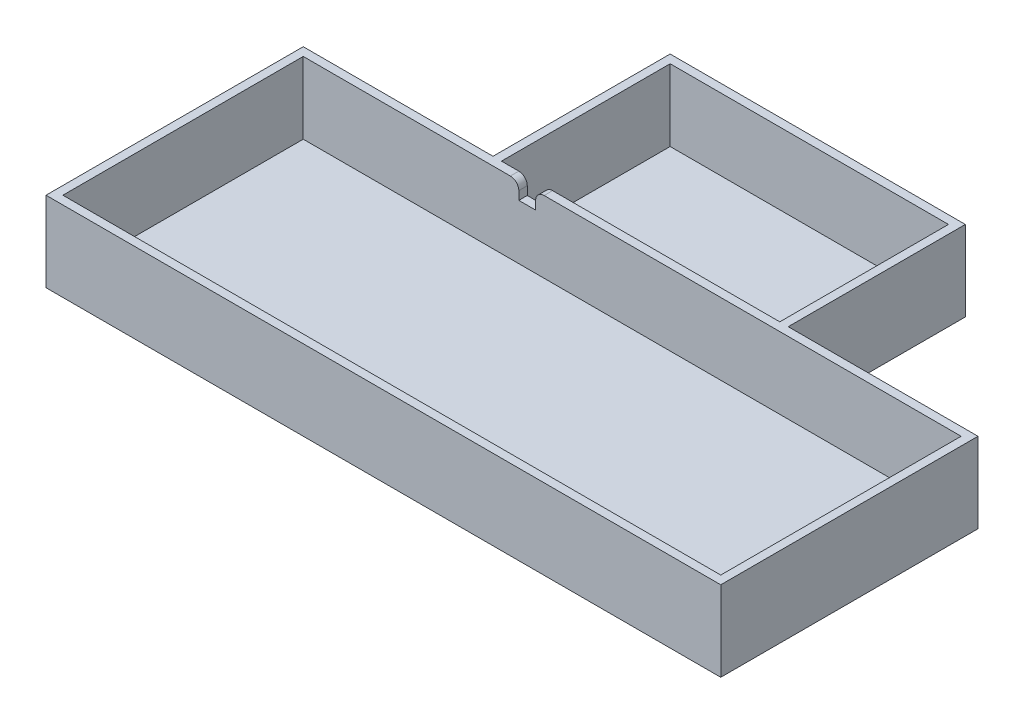
ISO-10303-21;
HEADER;
FILE_DESCRIPTION(('STEP AP214'),'2;1');
FILE_NAME('part.step','',(''),(''),'','','');
FILE_SCHEMA(('AUTOMOTIVE_DESIGN { 1 0 10303 214 1 1 1 1 }'));
ENDSEC;
DATA;
#1=APPLICATION_CONTEXT('core data for automotive mechanical design processes');
#2=APPLICATION_PROTOCOL_DEFINITION('international standard','automotive_design',2000,#1);
#3=PRODUCT_CONTEXT('',#1,'mechanical');
#4=PRODUCT('Part','Part','',(#3));
#5=PRODUCT_RELATED_PRODUCT_CATEGORY('part','',(#4));
#6=PRODUCT_DEFINITION_FORMATION('','',#4);
#7=PRODUCT_DEFINITION_CONTEXT('part definition',#1,'design');
#8=PRODUCT_DEFINITION('design','',#6,#7);
#9=PRODUCT_DEFINITION_SHAPE('','',#8);
#10=(LENGTH_UNIT() NAMED_UNIT(*) SI_UNIT(.MILLI.,.METRE.));
#11=(NAMED_UNIT(*) PLANE_ANGLE_UNIT() SI_UNIT($,.RADIAN.));
#12=(NAMED_UNIT(*) SI_UNIT($,.STERADIAN.) SOLID_ANGLE_UNIT());
#13=UNCERTAINTY_MEASURE_WITH_UNIT(LENGTH_MEASURE(1.E-05),#10,'distance_accuracy_value','');
#14=(GEOMETRIC_REPRESENTATION_CONTEXT(3) GLOBAL_UNCERTAINTY_ASSIGNED_CONTEXT((#13)) GLOBAL_UNIT_ASSIGNED_CONTEXT((#10,
#11,#12)) REPRESENTATION_CONTEXT('',''));
#15=CARTESIAN_POINT('',(0.,0.,0.));
#16=DIRECTION('',(0.,0.,1.));
#17=DIRECTION('',(1.,0.,0.));
#18=AXIS2_PLACEMENT_3D('',#15,#16,#17);
#19=CARTESIAN_POINT('',(0.,2.,0.));
#20=DIRECTION('',(0.,0.,1.));
#21=DIRECTION('',(1.,0.,0.));
#22=AXIS2_PLACEMENT_3D('',#19,#20,#21);
#23=PLANE('',#22);
#24=DIRECTION('',(1.,0.,0.));
#25=VECTOR('',#24,1.);
#26=CARTESIAN_POINT('',(0.,19.,0.));
#27=LINE('',#26,#25);
#28=CARTESIAN_POINT('',(0.,19.,0.));
#29=VERTEX_POINT('',#28);
#30=CARTESIAN_POINT('',(45.0000000000007,19.,0.));
#31=VERTEX_POINT('',#30);
#32=EDGE_CURVE('E357',#29,#31,#27,.T.);
#33=ORIENTED_EDGE('',*,*,#32,.T.);
#34=DIRECTION('',(0.,1.,0.));
#35=VECTOR('',#34,1.);
#36=CARTESIAN_POINT('',(45.0000000000007,0.,0.));
#37=LINE('',#36,#35);
#38=CARTESIAN_POINT('',(45.0000000000007,0.,0.));
#39=VERTEX_POINT('',#38);
#40=EDGE_CURVE('E275',#39,#31,#37,.T.);
#41=ORIENTED_EDGE('',*,*,#40,.F.);
#42=DIRECTION('',(-1.,0.,0.));
#43=VECTOR('',#42,1.);
#44=CARTESIAN_POINT('',(0.,0.,0.));
#45=LINE('',#44,#43);
#46=CARTESIAN_POINT('',(0.,0.,0.));
#47=VERTEX_POINT('',#46);
#48=EDGE_CURVE('E375',#39,#47,#45,.T.);
#49=ORIENTED_EDGE('',*,*,#48,.T.);
#50=DIRECTION('',(0.,-1.,0.));
#51=VECTOR('',#50,1.);
#52=CARTESIAN_POINT('',(0.,2.,0.));
#53=LINE('',#52,#51);
#54=EDGE_CURVE('E379',#29,#47,#53,.T.);
#55=ORIENTED_EDGE('',*,*,#54,.F.);
#56=EDGE_LOOP('',(#33,#41,#49,#55));
#57=FACE_BOUND('',#56,.T.);
#58=ADVANCED_FACE('F41',(#57),#23,.F.);
#59=DIRECTION('',(-1.,0.,0.));
#60=VECTOR('',#59,1.);
#61=CARTESIAN_POINT('',(0.,1.99999999999997,0.));
#62=LINE('',#61,#60);
#63=CARTESIAN_POINT('',(113.000000000001,1.99999999999997,0.));
#64=VERTEX_POINT('',#63);
#65=CARTESIAN_POINT('',(47.0000000000007,1.99999999999997,0.));
#66=VERTEX_POINT('',#65);
#67=EDGE_CURVE('E289',#64,#66,#62,.T.);
#68=ORIENTED_EDGE('',*,*,#67,.T.);
#69=DIRECTION('',(0.,-1.,0.));
#70=VECTOR('',#69,1.);
#71=CARTESIAN_POINT('',(47.0000000000007,19.,0.));
#72=LINE('',#71,#70);
#73=CARTESIAN_POINT('',(47.0000000000007,19.,0.));
#74=VERTEX_POINT('',#73);
#75=EDGE_CURVE('E219',#74,#66,#72,.T.);
#76=ORIENTED_EDGE('',*,*,#75,.F.);
#77=CARTESIAN_POINT('',(51.1169372831861,19.,0.));
#78=VERTEX_POINT('',#77);
#79=EDGE_CURVE('E207',#74,#78,#27,.T.);
#80=ORIENTED_EDGE('',*,*,#79,.T.);
#81=CARTESIAN_POINT('',(51.1169372831861,17.,0.));
#82=DIRECTION('',(0.,0.,1.));
#83=DIRECTION('',(1.,0.,0.));
#84=AXIS2_PLACEMENT_3D('',#81,#82,#83);
#85=CIRCLE('',#84,2.);
#86=CARTESIAN_POINT('',(53.1169372831861,17.,0.));
#87=VERTEX_POINT('',#86);
#88=EDGE_CURVE('E404',#78,#87,#85,.F.);
#89=ORIENTED_EDGE('',*,*,#88,.T.);
#90=DIRECTION('',(0.,-1.,0.));
#91=VECTOR('',#90,1.);
#92=CARTESIAN_POINT('',(53.1169372831861,23.,0.));
#93=LINE('',#92,#91);
#94=CARTESIAN_POINT('',(53.1169372831861,15.,0.));
#95=VERTEX_POINT('',#94);
#96=EDGE_CURVE('E254',#87,#95,#93,.T.);
#97=ORIENTED_EDGE('',*,*,#96,.T.);
#98=DIRECTION('',(-1.,0.,0.));
#99=VECTOR('',#98,1.);
#100=CARTESIAN_POINT('',(57.1169372831861,15.,0.));
#101=LINE('',#100,#99);
#102=CARTESIAN_POINT('',(57.1169372831861,15.,0.));
#103=VERTEX_POINT('',#102);
#104=EDGE_CURVE('E250',#103,#95,#101,.T.);
#105=ORIENTED_EDGE('',*,*,#104,.F.);
#106=DIRECTION('',(0.,-1.,0.));
#107=VECTOR('',#106,1.);
#108=CARTESIAN_POINT('',(57.1169372831861,23.,0.));
#109=LINE('',#108,#107);
#110=CARTESIAN_POINT('',(57.1169372831861,17.,0.));
#111=VERTEX_POINT('',#110);
#112=EDGE_CURVE('E247',#111,#103,#109,.T.);
#113=ORIENTED_EDGE('',*,*,#112,.F.);
#114=CARTESIAN_POINT('',(59.1169372831861,17.,0.));
#115=DIRECTION('',(0.,0.,1.));
#116=DIRECTION('',(1.,0.,0.));
#117=AXIS2_PLACEMENT_3D('',#114,#115,#116);
#118=CIRCLE('',#117,2.);
#119=CARTESIAN_POINT('',(59.1169372831861,19.,0.));
#120=VERTEX_POINT('',#119);
#121=EDGE_CURVE('E401',#111,#120,#118,.F.);
#122=ORIENTED_EDGE('',*,*,#121,.T.);
#123=CARTESIAN_POINT('',(113.000000000001,19.,0.));
#124=VERTEX_POINT('',#123);
#125=EDGE_CURVE('E362',#120,#124,#27,.T.);
#126=ORIENTED_EDGE('',*,*,#125,.T.);
#127=DIRECTION('',(0.,-1.,0.));
#128=VECTOR('',#127,1.);
#129=CARTESIAN_POINT('',(113.000000000001,19.,0.));
#130=LINE('',#129,#128);
#131=EDGE_CURVE('E241',#124,#64,#130,.T.);
#132=ORIENTED_EDGE('',*,*,#131,.T.);
#133=EDGE_LOOP('',(#68,#76,#80,#89,#97,#105,#113,#122,#126,#132));
#134=FACE_BOUND('',#133,.T.);
#135=ADVANCED_FACE('F427',(#134),#23,.F.);
#136=CARTESIAN_POINT('',(0.,1.99999999999997,-42.));
#137=DIRECTION('',(0.,1.,0.));
#138=DIRECTION('',(0.,0.,1.));
#139=AXIS2_PLACEMENT_3D('',#136,#137,#138);
#140=PLANE('',#139);
#141=DIRECTION('',(0.,0.,1.));
#142=VECTOR('',#141,1.);
#143=CARTESIAN_POINT('',(47.0000000000007,1.99999999999997,0.));
#144=LINE('',#143,#142);
#145=CARTESIAN_POINT('',(47.0000000000007,1.99999999999997,-40.));
#146=VERTEX_POINT('',#145);
#147=EDGE_CURVE('E196',#146,#66,#144,.T.);
#148=ORIENTED_EDGE('',*,*,#147,.T.);
#149=ORIENTED_EDGE('',*,*,#67,.F.);
#150=DIRECTION('',(0.,0.,1.));
#151=VECTOR('',#150,1.);
#152=CARTESIAN_POINT('',(113.000000000001,1.99999999999997,-42.));
#153=LINE('',#152,#151);
#154=CARTESIAN_POINT('',(113.000000000001,1.99999999999997,-40.));
#155=VERTEX_POINT('',#154);
#156=EDGE_CURVE('E200',#155,#64,#153,.T.);
#157=ORIENTED_EDGE('',*,*,#156,.F.);
#158=DIRECTION('',(-1.,0.,0.));
#159=VECTOR('',#158,1.);
#160=CARTESIAN_POINT('',(0.,1.99999999999997,-40.));
#161=LINE('',#160,#159);
#162=EDGE_CURVE('E209',#155,#146,#161,.T.);
#163=ORIENTED_EDGE('',*,*,#162,.T.);
#164=EDGE_LOOP('',(#148,#149,#157,#163));
#165=FACE_BOUND('',#164,.T.);
#166=ADVANCED_FACE('F498',(#165),#140,.T.);
#167=CARTESIAN_POINT('',(0.,19.,2.));
#168=DIRECTION('',(0.,0.,-1.));
#169=DIRECTION('',(-1.,0.,0.));
#170=AXIS2_PLACEMENT_3D('',#167,#168,#169);
#171=PLANE('',#170);
#172=DIRECTION('',(0.,-1.,0.));
#173=VECTOR('',#172,1.);
#174=CARTESIAN_POINT('',(53.1169372831861,19.,2.));
#175=LINE('',#174,#173);
#176=CARTESIAN_POINT('',(53.1169372831861,17.,2.));
#177=VERTEX_POINT('',#176);
#178=CARTESIAN_POINT('',(53.1169372831861,15.,2.));
#179=VERTEX_POINT('',#178);
#180=EDGE_CURVE('E262',#177,#179,#175,.T.);
#181=ORIENTED_EDGE('',*,*,#180,.F.);
#182=CARTESIAN_POINT('',(51.1169372831861,17.,2.));
#183=DIRECTION('',(0.,0.,-1.));
#184=DIRECTION('',(-1.,0.,0.));
#185=AXIS2_PLACEMENT_3D('',#182,#183,#184);
#186=CIRCLE('',#185,2.);
#187=CARTESIAN_POINT('',(51.1169372831861,19.,2.));
#188=VERTEX_POINT('',#187);
#189=EDGE_CURVE('E50',#177,#188,#186,.F.);
#190=ORIENTED_EDGE('',*,*,#189,.T.);
#191=DIRECTION('',(1.,0.,0.));
#192=VECTOR('',#191,1.);
#193=CARTESIAN_POINT('',(0.,19.,2.));
#194=LINE('',#193,#192);
#195=CARTESIAN_POINT('',(2.00000000000001,19.,2.));
#196=VERTEX_POINT('',#195);
#197=EDGE_CURVE('E348',#196,#188,#194,.T.);
#198=ORIENTED_EDGE('',*,*,#197,.F.);
#199=DIRECTION('',(0.,-1.,0.));
#200=VECTOR('',#199,1.);
#201=CARTESIAN_POINT('',(2.00000000000001,19.,2.));
#202=LINE('',#201,#200);
#203=CARTESIAN_POINT('',(2.00000000000001,2.,2.));
#204=VERTEX_POINT('',#203);
#205=EDGE_CURVE('E320',#196,#204,#202,.T.);
#206=ORIENTED_EDGE('',*,*,#205,.T.);
#207=DIRECTION('',(1.,0.,0.));
#208=VECTOR('',#207,1.);
#209=CARTESIAN_POINT('',(0.,2.,2.));
#210=LINE('',#209,#208);
#211=CARTESIAN_POINT('',(158.,2.,2.));
#212=VERTEX_POINT('',#211);
#213=EDGE_CURVE('E342',#204,#212,#210,.T.);
#214=ORIENTED_EDGE('',*,*,#213,.T.);
#215=DIRECTION('',(0.,-1.,0.));
#216=VECTOR('',#215,1.);
#217=CARTESIAN_POINT('',(158.,19.,2.));
#218=LINE('',#217,#216);
#219=CARTESIAN_POINT('',(158.,19.,2.));
#220=VERTEX_POINT('',#219);
#221=EDGE_CURVE('E339',#220,#212,#218,.T.);
#222=ORIENTED_EDGE('',*,*,#221,.F.);
#223=CARTESIAN_POINT('',(59.1169372831861,19.,2.));
#224=VERTEX_POINT('',#223);
#225=EDGE_CURVE('E347',#224,#220,#194,.T.);
#226=ORIENTED_EDGE('',*,*,#225,.F.);
#227=CARTESIAN_POINT('',(59.1169372831861,17.,2.));
#228=DIRECTION('',(0.,0.,-1.));
#229=DIRECTION('',(-1.,0.,0.));
#230=AXIS2_PLACEMENT_3D('',#227,#228,#229);
#231=CIRCLE('',#230,2.);
#232=CARTESIAN_POINT('',(57.1169372831861,17.,2.));
#233=VERTEX_POINT('',#232);
#234=EDGE_CURVE('E410',#224,#233,#231,.F.);
#235=ORIENTED_EDGE('',*,*,#234,.T.);
#236=DIRECTION('',(0.,-1.,0.));
#237=VECTOR('',#236,1.);
#238=CARTESIAN_POINT('',(57.1169372831861,19.,2.));
#239=LINE('',#238,#237);
#240=CARTESIAN_POINT('',(57.1169372831861,15.,2.));
#241=VERTEX_POINT('',#240);
#242=EDGE_CURVE('E268',#233,#241,#239,.T.);
#243=ORIENTED_EDGE('',*,*,#242,.T.);
#244=DIRECTION('',(-1.,0.,0.));
#245=VECTOR('',#244,1.);
#246=CARTESIAN_POINT('',(0.,15.,2.));
#247=LINE('',#246,#245);
#248=EDGE_CURVE('E271',#241,#179,#247,.T.);
#249=ORIENTED_EDGE('',*,*,#248,.T.);
#250=EDGE_LOOP('',(#181,#190,#198,#206,#214,#222,#226,#235,#243,#249));
#251=FACE_BOUND('',#250,.T.);
#252=ADVANCED_FACE('F417',(#251),#171,.F.);
#253=CARTESIAN_POINT('',(0.,2.,0.));
#254=DIRECTION('',(1.,0.,0.));
#255=DIRECTION('',(0.,0.,-1.));
#256=AXIS2_PLACEMENT_3D('',#253,#254,#255);
#257=PLANE('',#256);
#258=DIRECTION('',(0.,-1.,0.));
#259=VECTOR('',#258,1.);
#260=CARTESIAN_POINT('',(0.,2.,61.));
#261=LINE('',#260,#259);
#262=CARTESIAN_POINT('',(0.,19.,61.));
#263=VERTEX_POINT('',#262);
#264=CARTESIAN_POINT('',(0.,0.,61.));
#265=VERTEX_POINT('',#264);
#266=EDGE_CURVE('E391',#263,#265,#261,.T.);
#267=ORIENTED_EDGE('',*,*,#266,.F.);
#268=DIRECTION('',(0.,0.,1.));
#269=VECTOR('',#268,1.);
#270=CARTESIAN_POINT('',(0.,19.,0.));
#271=LINE('',#270,#269);
#272=EDGE_CURVE('E343',#29,#263,#271,.T.);
#273=ORIENTED_EDGE('',*,*,#272,.F.);
#274=ORIENTED_EDGE('',*,*,#54,.T.);
#275=DIRECTION('',(0.,0.,1.));
#276=VECTOR('',#275,1.);
#277=CARTESIAN_POINT('',(0.,0.,0.));
#278=LINE('',#277,#276);
#279=EDGE_CURVE('E361',#47,#265,#278,.T.);
#280=ORIENTED_EDGE('',*,*,#279,.T.);
#281=EDGE_LOOP('',(#267,#273,#274,#280));
#282=FACE_BOUND('',#281,.T.);
#283=ADVANCED_FACE('F461',(#282),#257,.F.);
#284=CARTESIAN_POINT('',(0.,2.,61.));
#285=DIRECTION('',(0.,0.,-1.));
#286=DIRECTION('',(-1.,0.,0.));
#287=AXIS2_PLACEMENT_3D('',#284,#285,#286);
#288=PLANE('',#287);
#289=DIRECTION('',(1.,0.,0.));
#290=VECTOR('',#289,1.);
#291=CARTESIAN_POINT('',(0.,0.,61.));
#292=LINE('',#291,#290);
#293=CARTESIAN_POINT('',(160.,0.,61.));
#294=VERTEX_POINT('',#293);
#295=EDGE_CURVE('E369',#265,#294,#292,.T.);
#296=ORIENTED_EDGE('',*,*,#295,.T.);
#297=DIRECTION('',(0.,-1.,0.));
#298=VECTOR('',#297,1.);
#299=CARTESIAN_POINT('',(160.,2.,61.));
#300=LINE('',#299,#298);
#301=CARTESIAN_POINT('',(160.,19.,61.));
#302=VERTEX_POINT('',#301);
#303=EDGE_CURVE('E387',#302,#294,#300,.T.);
#304=ORIENTED_EDGE('',*,*,#303,.F.);
#305=DIRECTION('',(1.,0.,0.));
#306=VECTOR('',#305,1.);
#307=CARTESIAN_POINT('',(0.,19.,61.));
#308=LINE('',#307,#306);
#309=EDGE_CURVE('E303',#263,#302,#308,.T.);
#310=ORIENTED_EDGE('',*,*,#309,.F.);
#311=ORIENTED_EDGE('',*,*,#266,.T.);
#312=EDGE_LOOP('',(#296,#304,#310,#311));
#313=FACE_BOUND('',#312,.T.);
#314=ADVANCED_FACE('F468',(#313),#288,.F.);
#315=CARTESIAN_POINT('',(160.,2.,0.));
#316=DIRECTION('',(-1.,0.,0.));
#317=DIRECTION('',(0.,0.,1.));
#318=AXIS2_PLACEMENT_3D('',#315,#316,#317);
#319=PLANE('',#318);
#320=DIRECTION('',(0.,0.,-1.));
#321=VECTOR('',#320,1.);
#322=CARTESIAN_POINT('',(160.,0.,0.));
#323=LINE('',#322,#321);
#324=CARTESIAN_POINT('',(160.,0.,0.));
#325=VERTEX_POINT('',#324);
#326=EDGE_CURVE('E372',#294,#325,#323,.T.);
#327=ORIENTED_EDGE('',*,*,#326,.T.);
#328=DIRECTION('',(0.,-1.,0.));
#329=VECTOR('',#328,1.);
#330=CARTESIAN_POINT('',(160.,2.,0.));
#331=LINE('',#330,#329);
#332=CARTESIAN_POINT('',(160.,19.,0.));
#333=VERTEX_POINT('',#332);
#334=EDGE_CURVE('E383',#333,#325,#331,.T.);
#335=ORIENTED_EDGE('',*,*,#334,.F.);
#336=DIRECTION('',(0.,0.,1.));
#337=VECTOR('',#336,1.);
#338=CARTESIAN_POINT('',(160.,19.,0.));
#339=LINE('',#338,#337);
#340=EDGE_CURVE('E352',#333,#302,#339,.T.);
#341=ORIENTED_EDGE('',*,*,#340,.T.);
#342=ORIENTED_EDGE('',*,*,#303,.T.);
#343=EDGE_LOOP('',(#327,#335,#341,#342));
#344=FACE_BOUND('',#343,.T.);
#345=ADVANCED_FACE('F484',(#344),#319,.F.);
#346=DIRECTION('',(0.,1.,0.));
#347=VECTOR('',#346,1.);
#348=CARTESIAN_POINT('',(115.000000000001,0.,0.));
#349=LINE('',#348,#347);
#350=CARTESIAN_POINT('',(115.000000000001,0.,0.));
#351=VERTEX_POINT('',#350);
#352=CARTESIAN_POINT('',(115.000000000001,19.,0.));
#353=VERTEX_POINT('',#352);
#354=EDGE_CURVE('E65',#351,#353,#349,.T.);
#355=ORIENTED_EDGE('',*,*,#354,.T.);
#356=EDGE_CURVE('E356',#353,#333,#27,.T.);
#357=ORIENTED_EDGE('',*,*,#356,.T.);
#358=ORIENTED_EDGE('',*,*,#334,.T.);
#359=EDGE_CURVE('E376',#325,#351,#45,.T.);
#360=ORIENTED_EDGE('',*,*,#359,.T.);
#361=EDGE_LOOP('',(#355,#357,#358,#360));
#362=FACE_BOUND('',#361,.T.);
#363=ADVANCED_FACE('F482',(#362),#23,.F.);
#364=CARTESIAN_POINT('',(0.,2.,0.));
#365=DIRECTION('',(0.,1.,0.));
#366=DIRECTION('',(0.,0.,1.));
#367=AXIS2_PLACEMENT_3D('',#364,#365,#366);
#368=PLANE('',#367);
#369=DIRECTION('',(0.,0.,-1.));
#370=VECTOR('',#369,1.);
#371=CARTESIAN_POINT('',(158.,2.,0.));
#372=LINE('',#371,#370);
#373=CARTESIAN_POINT('',(158.,2.,59.));
#374=VERTEX_POINT('',#373);
#375=EDGE_CURVE('E302',#374,#212,#372,.T.);
#376=ORIENTED_EDGE('',*,*,#375,.T.);
#377=ORIENTED_EDGE('',*,*,#213,.F.);
#378=DIRECTION('',(0.,0.,-1.));
#379=VECTOR('',#378,1.);
#380=CARTESIAN_POINT('',(2.00000000000001,2.,0.));
#381=LINE('',#380,#379);
#382=CARTESIAN_POINT('',(2.00000000000001,2.,59.));
#383=VERTEX_POINT('',#382);
#384=EDGE_CURVE('E308',#383,#204,#381,.T.);
#385=ORIENTED_EDGE('',*,*,#384,.F.);
#386=DIRECTION('',(1.,0.,0.));
#387=VECTOR('',#386,1.);
#388=CARTESIAN_POINT('',(0.,2.,59.));
#389=LINE('',#388,#387);
#390=EDGE_CURVE('E324',#383,#374,#389,.T.);
#391=ORIENTED_EDGE('',*,*,#390,.T.);
#392=EDGE_LOOP('',(#376,#377,#385,#391));
#393=FACE_BOUND('',#392,.T.);
#394=ADVANCED_FACE('F491',(#393),#368,.T.);
#395=CARTESIAN_POINT('',(0.,0.,0.));
#396=DIRECTION('',(0.,1.,0.));
#397=DIRECTION('',(0.,0.,1.));
#398=AXIS2_PLACEMENT_3D('',#395,#396,#397);
#399=PLANE('',#398);
#400=ORIENTED_EDGE('',*,*,#279,.F.);
#401=ORIENTED_EDGE('',*,*,#48,.F.);
#402=DIRECTION('',(0.,0.,1.));
#403=VECTOR('',#402,1.);
#404=CARTESIAN_POINT('',(45.0000000000007,0.,-42.));
#405=LINE('',#404,#403);
#406=CARTESIAN_POINT('',(45.0000000000007,0.,-42.));
#407=VERTEX_POINT('',#406);
#408=EDGE_CURVE('E298',#407,#39,#405,.T.);
#409=ORIENTED_EDGE('',*,*,#408,.F.);
#410=DIRECTION('',(-1.,0.,0.));
#411=VECTOR('',#410,1.);
#412=CARTESIAN_POINT('',(0.,0.,-42.));
#413=LINE('',#412,#411);
#414=CARTESIAN_POINT('',(115.000000000001,0.,-42.));
#415=VERTEX_POINT('',#414);
#416=EDGE_CURVE('E276',#415,#407,#413,.T.);
#417=ORIENTED_EDGE('',*,*,#416,.F.);
#418=DIRECTION('',(0.,0.,1.));
#419=VECTOR('',#418,1.);
#420=CARTESIAN_POINT('',(115.000000000001,0.,-42.));
#421=LINE('',#420,#419);
#422=EDGE_CURVE('E286',#415,#351,#421,.T.);
#423=ORIENTED_EDGE('',*,*,#422,.T.);
#424=ORIENTED_EDGE('',*,*,#359,.F.);
#425=ORIENTED_EDGE('',*,*,#326,.F.);
#426=ORIENTED_EDGE('',*,*,#295,.F.);
#427=EDGE_LOOP('',(#400,#401,#409,#417,#423,#424,#425,#426));
#428=FACE_BOUND('',#427,.T.);
#429=ADVANCED_FACE('F463',(#428),#399,.F.);
#430=CARTESIAN_POINT('',(0.,19.,0.));
#431=DIRECTION('',(0.,1.,0.));
#432=DIRECTION('',(0.,0.,1.));
#433=AXIS2_PLACEMENT_3D('',#430,#431,#432);
#434=PLANE('',#433);
#435=ORIENTED_EDGE('',*,*,#79,.F.);
#436=DIRECTION('',(0.,0.,1.));
#437=VECTOR('',#436,1.);
#438=CARTESIAN_POINT('',(47.0000000000007,19.,0.));
#439=LINE('',#438,#437);
#440=CARTESIAN_POINT('',(47.0000000000007,19.,-40.));
#441=VERTEX_POINT('',#440);
#442=EDGE_CURVE('E193',#441,#74,#439,.T.);
#443=ORIENTED_EDGE('',*,*,#442,.F.);
#444=DIRECTION('',(-1.,0.,0.));
#445=VECTOR('',#444,1.);
#446=CARTESIAN_POINT('',(0.,19.,-40.));
#447=LINE('',#446,#445);
#448=CARTESIAN_POINT('',(113.000000000001,19.,-40.));
#449=VERTEX_POINT('',#448);
#450=EDGE_CURVE('E57',#449,#441,#447,.T.);
#451=ORIENTED_EDGE('',*,*,#450,.F.);
#452=DIRECTION('',(0.,0.,1.));
#453=VECTOR('',#452,1.);
#454=CARTESIAN_POINT('',(113.000000000001,19.,-42.));
#455=LINE('',#454,#453);
#456=EDGE_CURVE('E234',#449,#124,#455,.T.);
#457=ORIENTED_EDGE('',*,*,#456,.T.);
#458=ORIENTED_EDGE('',*,*,#125,.F.);
#459=DIRECTION('',(0.,0.,-1.));
#460=VECTOR('',#459,1.);
#461=CARTESIAN_POINT('',(59.1169372831861,19.,2.));
#462=LINE('',#461,#460);
#463=EDGE_CURVE('E395',#120,#224,#462,.F.);
#464=ORIENTED_EDGE('',*,*,#463,.T.);
#465=ORIENTED_EDGE('',*,*,#225,.T.);
#466=DIRECTION('',(0.,0.,-1.));
#467=VECTOR('',#466,1.);
#468=CARTESIAN_POINT('',(158.,19.,0.));
#469=LINE('',#468,#467);
#470=CARTESIAN_POINT('',(158.,19.,59.));
#471=VERTEX_POINT('',#470);
#472=EDGE_CURVE('E307',#471,#220,#469,.T.);
#473=ORIENTED_EDGE('',*,*,#472,.F.);
#474=DIRECTION('',(1.,0.,0.));
#475=VECTOR('',#474,1.);
#476=CARTESIAN_POINT('',(0.,19.,59.));
#477=LINE('',#476,#475);
#478=CARTESIAN_POINT('',(2.00000000000001,19.,59.));
#479=VERTEX_POINT('',#478);
#480=EDGE_CURVE('E312',#479,#471,#477,.T.);
#481=ORIENTED_EDGE('',*,*,#480,.F.);
#482=DIRECTION('',(0.,0.,-1.));
#483=VECTOR('',#482,1.);
#484=CARTESIAN_POINT('',(2.00000000000001,19.,0.));
#485=LINE('',#484,#483);
#486=EDGE_CURVE('E316',#479,#196,#485,.T.);
#487=ORIENTED_EDGE('',*,*,#486,.T.);
#488=ORIENTED_EDGE('',*,*,#197,.T.);
#489=DIRECTION('',(0.,0.,-1.));
#490=VECTOR('',#489,1.);
#491=CARTESIAN_POINT('',(51.1169372831861,19.,0.));
#492=LINE('',#491,#490);
#493=EDGE_CURVE('E398',#188,#78,#492,.T.);
#494=ORIENTED_EDGE('',*,*,#493,.T.);
#495=EDGE_LOOP('',(#435,#443,#451,#457,#458,#464,#465,#473,#481,#487,#488,#494));
#496=FACE_BOUND('',#495,.T.);
#497=DIRECTION('',(0.,0.,1.));
#498=VECTOR('',#497,1.);
#499=CARTESIAN_POINT('',(45.0000000000007,19.,0.));
#500=LINE('',#499,#498);
#501=CARTESIAN_POINT('',(45.0000000000007,19.,-42.));
#502=VERTEX_POINT('',#501);
#503=EDGE_CURVE('E215',#502,#31,#500,.T.);
#504=ORIENTED_EDGE('',*,*,#503,.T.);
#505=ORIENTED_EDGE('',*,*,#32,.F.);
#506=ORIENTED_EDGE('',*,*,#272,.T.);
#507=ORIENTED_EDGE('',*,*,#309,.T.);
#508=ORIENTED_EDGE('',*,*,#340,.F.);
#509=ORIENTED_EDGE('',*,*,#356,.F.);
#510=DIRECTION('',(0.,0.,1.));
#511=VECTOR('',#510,1.);
#512=CARTESIAN_POINT('',(115.000000000001,19.,-42.));
#513=LINE('',#512,#511);
#514=CARTESIAN_POINT('',(115.000000000001,19.,-42.));
#515=VERTEX_POINT('',#514);
#516=EDGE_CURVE('E237',#515,#353,#513,.T.);
#517=ORIENTED_EDGE('',*,*,#516,.F.);
#518=DIRECTION('',(-1.,0.,0.));
#519=VECTOR('',#518,1.);
#520=CARTESIAN_POINT('',(115.000000000001,19.,-42.));
#521=LINE('',#520,#519);
#522=EDGE_CURVE('E230',#515,#502,#521,.T.);
#523=ORIENTED_EDGE('',*,*,#522,.T.);
#524=EDGE_LOOP('',(#504,#505,#506,#507,#508,#509,#517,#523));
#525=FACE_BOUND('',#524,.T.);
#526=ADVANCED_FACE('F204',(#496,#525),#434,.T.);
#527=CARTESIAN_POINT('',(158.,19.,0.));
#528=DIRECTION('',(-1.,0.,0.));
#529=DIRECTION('',(0.,0.,1.));
#530=AXIS2_PLACEMENT_3D('',#527,#528,#529);
#531=PLANE('',#530);
#532=ORIENTED_EDGE('',*,*,#375,.F.);
#533=DIRECTION('',(0.,-1.,0.));
#534=VECTOR('',#533,1.);
#535=CARTESIAN_POINT('',(158.,19.,59.));
#536=LINE('',#535,#534);
#537=EDGE_CURVE('E336',#471,#374,#536,.T.);
#538=ORIENTED_EDGE('',*,*,#537,.F.);
#539=ORIENTED_EDGE('',*,*,#472,.T.);
#540=ORIENTED_EDGE('',*,*,#221,.T.);
#541=EDGE_LOOP('',(#532,#538,#539,#540));
#542=FACE_BOUND('',#541,.T.);
#543=ADVANCED_FACE('F509',(#542),#531,.T.);
#544=CARTESIAN_POINT('',(0.,19.,59.));
#545=DIRECTION('',(0.,0.,-1.));
#546=DIRECTION('',(-1.,0.,0.));
#547=AXIS2_PLACEMENT_3D('',#544,#545,#546);
#548=PLANE('',#547);
#549=ORIENTED_EDGE('',*,*,#390,.F.);
#550=DIRECTION('',(0.,-1.,0.));
#551=VECTOR('',#550,1.);
#552=CARTESIAN_POINT('',(2.00000000000001,19.,59.));
#553=LINE('',#552,#551);
#554=EDGE_CURVE('E333',#479,#383,#553,.T.);
#555=ORIENTED_EDGE('',*,*,#554,.F.);
#556=ORIENTED_EDGE('',*,*,#480,.T.);
#557=ORIENTED_EDGE('',*,*,#537,.T.);
#558=EDGE_LOOP('',(#549,#555,#556,#557));
#559=FACE_BOUND('',#558,.T.);
#560=ADVANCED_FACE('F512',(#559),#548,.T.);
#561=CARTESIAN_POINT('',(2.00000000000001,19.,0.));
#562=DIRECTION('',(-1.,0.,0.));
#563=DIRECTION('',(0.,0.,1.));
#564=AXIS2_PLACEMENT_3D('',#561,#562,#563);
#565=PLANE('',#564);
#566=ORIENTED_EDGE('',*,*,#384,.T.);
#567=ORIENTED_EDGE('',*,*,#205,.F.);
#568=ORIENTED_EDGE('',*,*,#486,.F.);
#569=ORIENTED_EDGE('',*,*,#554,.T.);
#570=EDGE_LOOP('',(#566,#567,#568,#569));
#571=FACE_BOUND('',#570,.T.);
#572=ADVANCED_FACE('F516',(#571),#565,.F.);
#573=CARTESIAN_POINT('',(45.0000000000007,0.,-42.));
#574=DIRECTION('',(1.,0.,0.));
#575=DIRECTION('',(0.,0.,-1.));
#576=AXIS2_PLACEMENT_3D('',#573,#574,#575);
#577=PLANE('',#576);
#578=ORIENTED_EDGE('',*,*,#40,.T.);
#579=ORIENTED_EDGE('',*,*,#503,.F.);
#580=DIRECTION('',(0.,1.,0.));
#581=VECTOR('',#580,1.);
#582=CARTESIAN_POINT('',(45.0000000000007,0.,-42.));
#583=LINE('',#582,#581);
#584=EDGE_CURVE('E280',#407,#502,#583,.T.);
#585=ORIENTED_EDGE('',*,*,#584,.F.);
#586=ORIENTED_EDGE('',*,*,#408,.T.);
#587=EDGE_LOOP('',(#578,#579,#585,#586));
#588=FACE_BOUND('',#587,.T.);
#589=ADVANCED_FACE('F474',(#588),#577,.F.);
#590=CARTESIAN_POINT('',(115.000000000001,0.,-42.));
#591=DIRECTION('',(1.,0.,0.));
#592=DIRECTION('',(0.,0.,-1.));
#593=AXIS2_PLACEMENT_3D('',#590,#591,#592);
#594=PLANE('',#593);
#595=ORIENTED_EDGE('',*,*,#354,.F.);
#596=ORIENTED_EDGE('',*,*,#422,.F.);
#597=DIRECTION('',(0.,1.,0.));
#598=VECTOR('',#597,1.);
#599=CARTESIAN_POINT('',(115.000000000001,0.,-42.));
#600=LINE('',#599,#598);
#601=EDGE_CURVE('E283',#415,#515,#600,.T.);
#602=ORIENTED_EDGE('',*,*,#601,.T.);
#603=ORIENTED_EDGE('',*,*,#516,.T.);
#604=EDGE_LOOP('',(#595,#596,#602,#603));
#605=FACE_BOUND('',#604,.T.);
#606=ADVANCED_FACE('F480',(#605),#594,.T.);
#607=CARTESIAN_POINT('',(0.,0.,-42.));
#608=DIRECTION('',(0.,0.,-1.));
#609=DIRECTION('',(-1.,0.,0.));
#610=AXIS2_PLACEMENT_3D('',#607,#608,#609);
#611=PLANE('',#610);
#612=ORIENTED_EDGE('',*,*,#584,.T.);
#613=ORIENTED_EDGE('',*,*,#522,.F.);
#614=ORIENTED_EDGE('',*,*,#601,.F.);
#615=ORIENTED_EDGE('',*,*,#416,.T.);
#616=EDGE_LOOP('',(#612,#613,#614,#615));
#617=FACE_BOUND('',#616,.T.);
#618=ADVANCED_FACE('F478',(#617),#611,.T.);
#619=CARTESIAN_POINT('',(57.1169372831861,15.,39.));
#620=DIRECTION('',(0.,-1.,0.));
#621=DIRECTION('',(0.,0.,-1.));
#622=AXIS2_PLACEMENT_3D('',#619,#620,#621);
#623=PLANE('',#622);
#624=DIRECTION('',(0.,0.,-1.));
#625=VECTOR('',#624,1.);
#626=CARTESIAN_POINT('',(57.1169372831861,15.,39.));
#627=LINE('',#626,#625);
#628=EDGE_CURVE('E257',#241,#103,#627,.T.);
#629=ORIENTED_EDGE('',*,*,#628,.T.);
#630=ORIENTED_EDGE('',*,*,#104,.T.);
#631=DIRECTION('',(0.,0.,-1.));
#632=VECTOR('',#631,1.);
#633=CARTESIAN_POINT('',(53.1169372831861,15.,39.));
#634=LINE('',#633,#632);
#635=EDGE_CURVE('E258',#179,#95,#634,.T.);
#636=ORIENTED_EDGE('',*,*,#635,.F.);
#637=ORIENTED_EDGE('',*,*,#248,.F.);
#638=EDGE_LOOP('',(#629,#630,#636,#637));
#639=FACE_BOUND('',#638,.T.);
#640=ADVANCED_FACE('F434',(#639),#623,.F.);
#641=CARTESIAN_POINT('',(57.1169372831861,23.,39.));
#642=DIRECTION('',(1.,0.,0.));
#643=DIRECTION('',(0.,0.,-1.));
#644=AXIS2_PLACEMENT_3D('',#641,#642,#643);
#645=PLANE('',#644);
#646=ORIENTED_EDGE('',*,*,#242,.F.);
#647=DIRECTION('',(0.,0.,-1.));
#648=VECTOR('',#647,1.);
#649=CARTESIAN_POINT('',(57.1169372831861,17.,0.));
#650=LINE('',#649,#648);
#651=EDGE_CURVE('E11',#233,#111,#650,.T.);
#652=ORIENTED_EDGE('',*,*,#651,.T.);
#653=ORIENTED_EDGE('',*,*,#112,.T.);
#654=ORIENTED_EDGE('',*,*,#628,.F.);
#655=EDGE_LOOP('',(#646,#652,#653,#654));
#656=FACE_BOUND('',#655,.T.);
#657=ADVANCED_FACE('F441',(#656),#645,.F.);
#658=CARTESIAN_POINT('',(53.1169372831861,23.,39.));
#659=DIRECTION('',(1.,0.,0.));
#660=DIRECTION('',(0.,0.,-1.));
#661=AXIS2_PLACEMENT_3D('',#658,#659,#660);
#662=PLANE('',#661);
#663=ORIENTED_EDGE('',*,*,#96,.F.);
#664=DIRECTION('',(0.,0.,-1.));
#665=VECTOR('',#664,1.);
#666=CARTESIAN_POINT('',(53.1169372831861,17.,39.));
#667=LINE('',#666,#665);
#668=EDGE_CURVE('E407',#87,#177,#667,.F.);
#669=ORIENTED_EDGE('',*,*,#668,.T.);
#670=ORIENTED_EDGE('',*,*,#180,.T.);
#671=ORIENTED_EDGE('',*,*,#635,.T.);
#672=EDGE_LOOP('',(#663,#669,#670,#671));
#673=FACE_BOUND('',#672,.T.);
#674=ADVANCED_FACE('F430',(#673),#662,.T.);
#675=CARTESIAN_POINT('',(51.1169372831861,17.,0.));
#676=DIRECTION('',(0.,0.,-1.));
#677=DIRECTION('',(-1.,0.,0.));
#678=AXIS2_PLACEMENT_3D('',#675,#676,#677);
#679=CYLINDRICAL_SURFACE('',#678,2.);
#680=ORIENTED_EDGE('',*,*,#189,.F.);
#681=ORIENTED_EDGE('',*,*,#668,.F.);
#682=ORIENTED_EDGE('',*,*,#88,.F.);
#683=ORIENTED_EDGE('',*,*,#493,.F.);
#684=EDGE_LOOP('',(#680,#681,#682,#683));
#685=FACE_BOUND('',#684,.T.);
#686=ADVANCED_FACE('F424',(#685),#679,.T.);
#687=CARTESIAN_POINT('',(59.1169372831861,17.,39.));
#688=DIRECTION('',(0.,0.,1.));
#689=DIRECTION('',(1.,0.,0.));
#690=AXIS2_PLACEMENT_3D('',#687,#688,#689);
#691=CYLINDRICAL_SURFACE('',#690,2.);
#692=ORIENTED_EDGE('',*,*,#234,.F.);
#693=ORIENTED_EDGE('',*,*,#463,.F.);
#694=ORIENTED_EDGE('',*,*,#121,.F.);
#695=ORIENTED_EDGE('',*,*,#651,.F.);
#696=EDGE_LOOP('',(#692,#693,#694,#695));
#697=FACE_BOUND('',#696,.T.);
#698=ADVANCED_FACE('F43',(#697),#691,.T.);
#699=CARTESIAN_POINT('',(113.000000000001,19.,-42.));
#700=DIRECTION('',(1.,0.,0.));
#701=DIRECTION('',(0.,0.,-1.));
#702=AXIS2_PLACEMENT_3D('',#699,#700,#701);
#703=PLANE('',#702);
#704=ORIENTED_EDGE('',*,*,#456,.F.);
#705=DIRECTION('',(0.,-1.,0.));
#706=VECTOR('',#705,1.);
#707=CARTESIAN_POINT('',(113.000000000001,19.,-40.));
#708=LINE('',#707,#706);
#709=EDGE_CURVE('E201',#449,#155,#708,.T.);
#710=ORIENTED_EDGE('',*,*,#709,.T.);
#711=ORIENTED_EDGE('',*,*,#156,.T.);
#712=ORIENTED_EDGE('',*,*,#131,.F.);
#713=EDGE_LOOP('',(#704,#710,#711,#712));
#714=FACE_BOUND('',#713,.T.);
#715=ADVANCED_FACE('F536',(#714),#703,.F.);
#716=CARTESIAN_POINT('',(47.0000000000007,19.,0.));
#717=DIRECTION('',(1.,0.,0.));
#718=DIRECTION('',(0.,0.,-1.));
#719=AXIS2_PLACEMENT_3D('',#716,#717,#718);
#720=PLANE('',#719);
#721=ORIENTED_EDGE('',*,*,#147,.F.);
#722=DIRECTION('',(0.,-1.,0.));
#723=VECTOR('',#722,1.);
#724=CARTESIAN_POINT('',(47.0000000000007,19.,-40.));
#725=LINE('',#724,#723);
#726=EDGE_CURVE('E191',#441,#146,#725,.T.);
#727=ORIENTED_EDGE('',*,*,#726,.F.);
#728=ORIENTED_EDGE('',*,*,#442,.T.);
#729=ORIENTED_EDGE('',*,*,#75,.T.);
#730=EDGE_LOOP('',(#721,#727,#728,#729));
#731=FACE_BOUND('',#730,.T.);
#732=ADVANCED_FACE('F192',(#731),#720,.T.);
#733=CARTESIAN_POINT('',(0.,19.,-40.));
#734=DIRECTION('',(0.,0.,1.));
#735=DIRECTION('',(1.,0.,0.));
#736=AXIS2_PLACEMENT_3D('',#733,#734,#735);
#737=PLANE('',#736);
#738=ORIENTED_EDGE('',*,*,#162,.F.);
#739=ORIENTED_EDGE('',*,*,#709,.F.);
#740=ORIENTED_EDGE('',*,*,#450,.T.);
#741=ORIENTED_EDGE('',*,*,#726,.T.);
#742=EDGE_LOOP('',(#738,#739,#740,#741));
#743=FACE_BOUND('',#742,.T.);
#744=ADVANCED_FACE('F211',(#743),#737,.T.);
#745=CLOSED_SHELL('',(#58,#135,#166,#252,#283,#314,#345,#363,#394,#429,#526,#543,#560,#572,#589,
#606,#618,#640,#657,#674,#686,#698,#715,#732,#744));
#746=MANIFOLD_SOLID_BREP('B2',#745);
#747=ADVANCED_BREP_SHAPE_REPRESENTATION('',(#18,#746),#14);
#748=SHAPE_DEFINITION_REPRESENTATION(#9,#747);
ENDSEC;
END-ISO-10303-21;
